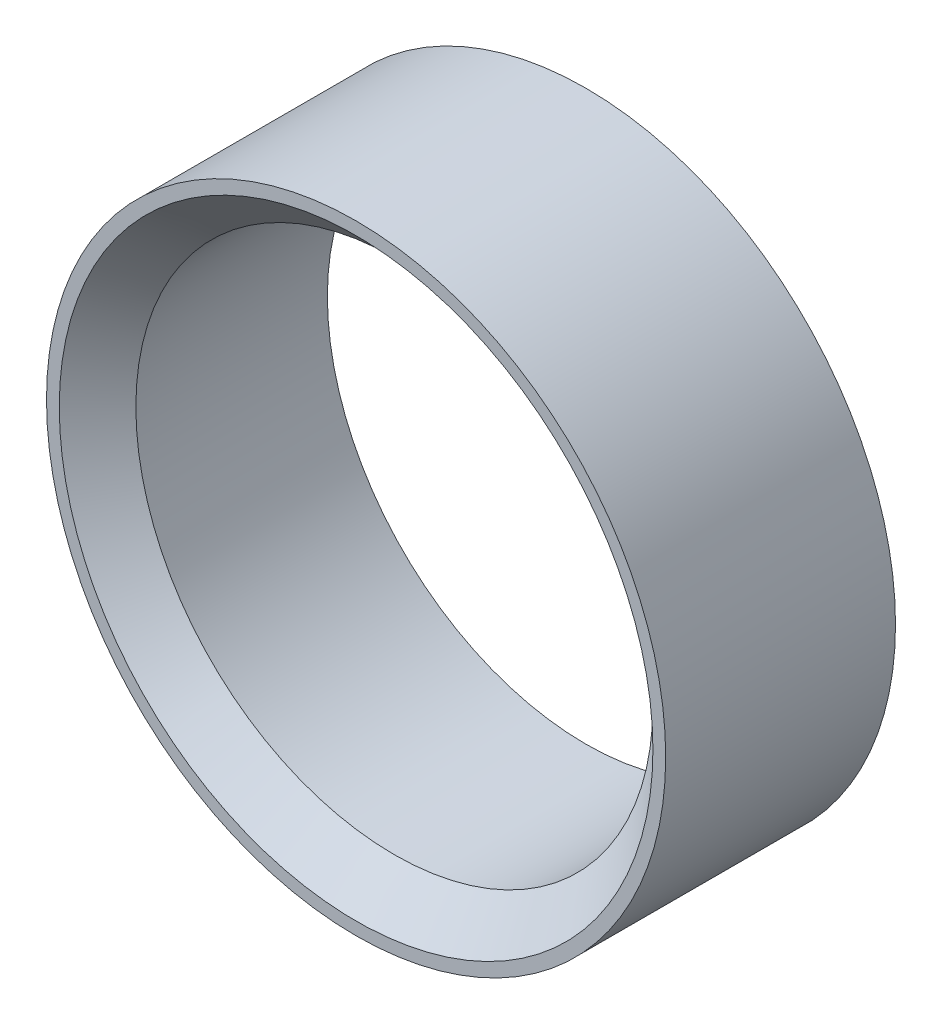
ISO-10303-21;
HEADER;
FILE_DESCRIPTION(('STEP AP214'),'2;1');
FILE_NAME('part.step','',(''),(''),'','','');
FILE_SCHEMA(('AUTOMOTIVE_DESIGN { 1 0 10303 214 1 1 1 1 }'));
ENDSEC;
DATA;
#1=APPLICATION_CONTEXT('core data for automotive mechanical design processes');
#2=APPLICATION_PROTOCOL_DEFINITION('international standard','automotive_design',2000,#1);
#3=PRODUCT_CONTEXT('',#1,'mechanical');
#4=PRODUCT('Part','Part','',(#3));
#5=PRODUCT_RELATED_PRODUCT_CATEGORY('part','',(#4));
#6=PRODUCT_DEFINITION_FORMATION('','',#4);
#7=PRODUCT_DEFINITION_CONTEXT('part definition',#1,'design');
#8=PRODUCT_DEFINITION('design','',#6,#7);
#9=PRODUCT_DEFINITION_SHAPE('','',#8);
#10=(LENGTH_UNIT() NAMED_UNIT(*) SI_UNIT(.MILLI.,.METRE.));
#11=(NAMED_UNIT(*) PLANE_ANGLE_UNIT() SI_UNIT($,.RADIAN.));
#12=(NAMED_UNIT(*) SI_UNIT($,.STERADIAN.) SOLID_ANGLE_UNIT());
#13=UNCERTAINTY_MEASURE_WITH_UNIT(LENGTH_MEASURE(1.E-05),#10,'distance_accuracy_value','');
#14=(GEOMETRIC_REPRESENTATION_CONTEXT(3) GLOBAL_UNCERTAINTY_ASSIGNED_CONTEXT((#13)) GLOBAL_UNIT_ASSIGNED_CONTEXT((#10,
#11,#12)) REPRESENTATION_CONTEXT('',''));
#15=CARTESIAN_POINT('',(0.,0.,0.));
#16=DIRECTION('',(0.,0.,1.));
#17=DIRECTION('',(1.,0.,0.));
#18=AXIS2_PLACEMENT_3D('',#15,#16,#17);
#19=CARTESIAN_POINT('',(0.,0.,48.));
#20=DIRECTION('',(0.,0.,-1.));
#21=DIRECTION('',(-1.,0.,0.));
#22=AXIS2_PLACEMENT_3D('',#19,#20,#21);
#23=CYLINDRICAL_SURFACE('',#22,24.25);
#24=CARTESIAN_POINT('',(0.,0.,48.));
#25=DIRECTION('',(0.,0.,1.));
#26=DIRECTION('',(1.,0.,0.));
#27=AXIS2_PLACEMENT_3D('',#24,#25,#26);
#28=CIRCLE('',#27,24.25);
#29=CARTESIAN_POINT('',(24.25,0.,48.));
#30=VERTEX_POINT('',#29);
#31=EDGE_CURVE('E47',#30,#30,#28,.T.);
#32=ORIENTED_EDGE('',*,*,#31,.F.);
#33=EDGE_LOOP('',(#32));
#34=FACE_BOUND('',#33,.T.);
#35=CARTESIAN_POINT('',(0.,0.,30.));
#36=DIRECTION('',(0.,0.,-1.));
#37=DIRECTION('',(-1.,0.,0.));
#38=AXIS2_PLACEMENT_3D('',#35,#36,#37);
#39=CIRCLE('',#38,24.25);
#40=CARTESIAN_POINT('',(-24.25,0.,30.));
#41=VERTEX_POINT('',#40);
#42=EDGE_CURVE('E52',#41,#41,#39,.T.);
#43=ORIENTED_EDGE('',*,*,#42,.F.);
#44=EDGE_LOOP('',(#43));
#45=FACE_BOUND('',#44,.T.);
#46=ADVANCED_FACE('F34',(#34,#45),#23,.T.);
#47=CARTESIAN_POINT('',(0.,0.,48.));
#48=DIRECTION('',(0.,0.,-1.));
#49=DIRECTION('',(-1.,0.,0.));
#50=AXIS2_PLACEMENT_3D('',#47,#48,#49);
#51=CYLINDRICAL_SURFACE('',#50,20.25);
#52=CARTESIAN_POINT('',(0.,0.,45.));
#53=DIRECTION('',(0.,0.,1.));
#54=DIRECTION('',(1.,0.,0.));
#55=AXIS2_PLACEMENT_3D('',#52,#53,#54);
#56=CIRCLE('',#55,20.25);
#57=CARTESIAN_POINT('',(20.25,0.,45.));
#58=VERTEX_POINT('',#57);
#59=EDGE_CURVE('E43',#58,#58,#56,.T.);
#60=ORIENTED_EDGE('',*,*,#59,.T.);
#61=EDGE_LOOP('',(#60));
#62=FACE_BOUND('',#61,.T.);
#63=CARTESIAN_POINT('',(0.,0.,30.));
#64=DIRECTION('',(0.,0.,-1.));
#65=DIRECTION('',(-1.,0.,0.));
#66=AXIS2_PLACEMENT_3D('',#63,#64,#65);
#67=CIRCLE('',#66,20.25);
#68=CARTESIAN_POINT('',(-20.25,0.,30.));
#69=VERTEX_POINT('',#68);
#70=EDGE_CURVE('E39',#69,#69,#67,.T.);
#71=ORIENTED_EDGE('',*,*,#70,.T.);
#72=EDGE_LOOP('',(#71));
#73=FACE_BOUND('',#72,.T.);
#74=ADVANCED_FACE('F59',(#62,#73),#51,.F.);
#75=CARTESIAN_POINT('',(0.,0.,48.));
#76=DIRECTION('',(0.,0.,1.));
#77=DIRECTION('',(1.,0.,0.));
#78=AXIS2_PLACEMENT_3D('',#75,#76,#77);
#79=PLANE('',#78);
#80=CARTESIAN_POINT('',(0.,0.,48.));
#81=DIRECTION('',(0.,0.,1.));
#82=DIRECTION('',(1.,0.,0.));
#83=AXIS2_PLACEMENT_3D('',#80,#81,#82);
#84=CIRCLE('',#83,23.25);
#85=CARTESIAN_POINT('',(23.25,0.,48.));
#86=VERTEX_POINT('',#85);
#87=EDGE_CURVE('E10',#86,#86,#84,.F.);
#88=ORIENTED_EDGE('',*,*,#87,.T.);
#89=EDGE_LOOP('',(#88));
#90=FACE_BOUND('',#89,.T.);
#91=ORIENTED_EDGE('',*,*,#31,.T.);
#92=EDGE_LOOP('',(#91));
#93=FACE_BOUND('',#92,.T.);
#94=ADVANCED_FACE('F67',(#90,#93),#79,.T.);
#95=CARTESIAN_POINT('',(0.,0.,45.));
#96=DIRECTION('',(0.,0.,1.));
#97=DIRECTION('',(1.,0.,0.));
#98=AXIS2_PLACEMENT_3D('',#95,#96,#97);
#99=CONICAL_SURFACE('',#98,20.25,0.785398163397451);
#100=ORIENTED_EDGE('',*,*,#87,.F.);
#101=EDGE_LOOP('',(#100));
#102=FACE_BOUND('',#101,.T.);
#103=ORIENTED_EDGE('',*,*,#59,.F.);
#104=EDGE_LOOP('',(#103));
#105=FACE_BOUND('',#104,.T.);
#106=ADVANCED_FACE('F37',(#102,#105),#99,.F.);
#107=CARTESIAN_POINT('',(0.,0.,30.));
#108=DIRECTION('',(0.,0.,-1.));
#109=DIRECTION('',(-1.,0.,0.));
#110=AXIS2_PLACEMENT_3D('',#107,#108,#109);
#111=PLANE('',#110);
#112=ORIENTED_EDGE('',*,*,#70,.F.);
#113=EDGE_LOOP('',(#112));
#114=FACE_BOUND('',#113,.T.);
#115=ORIENTED_EDGE('',*,*,#42,.T.);
#116=EDGE_LOOP('',(#115));
#117=FACE_BOUND('',#116,.T.);
#118=ADVANCED_FACE('F61',(#114,#117),#111,.T.);
#119=CLOSED_SHELL('',(#46,#74,#94,#106,#118));
#120=MANIFOLD_SOLID_BREP('B2',#119);
#121=ADVANCED_BREP_SHAPE_REPRESENTATION('',(#18,#120),#14);
#122=SHAPE_DEFINITION_REPRESENTATION(#9,#121);
ENDSEC;
END-ISO-10303-21;
